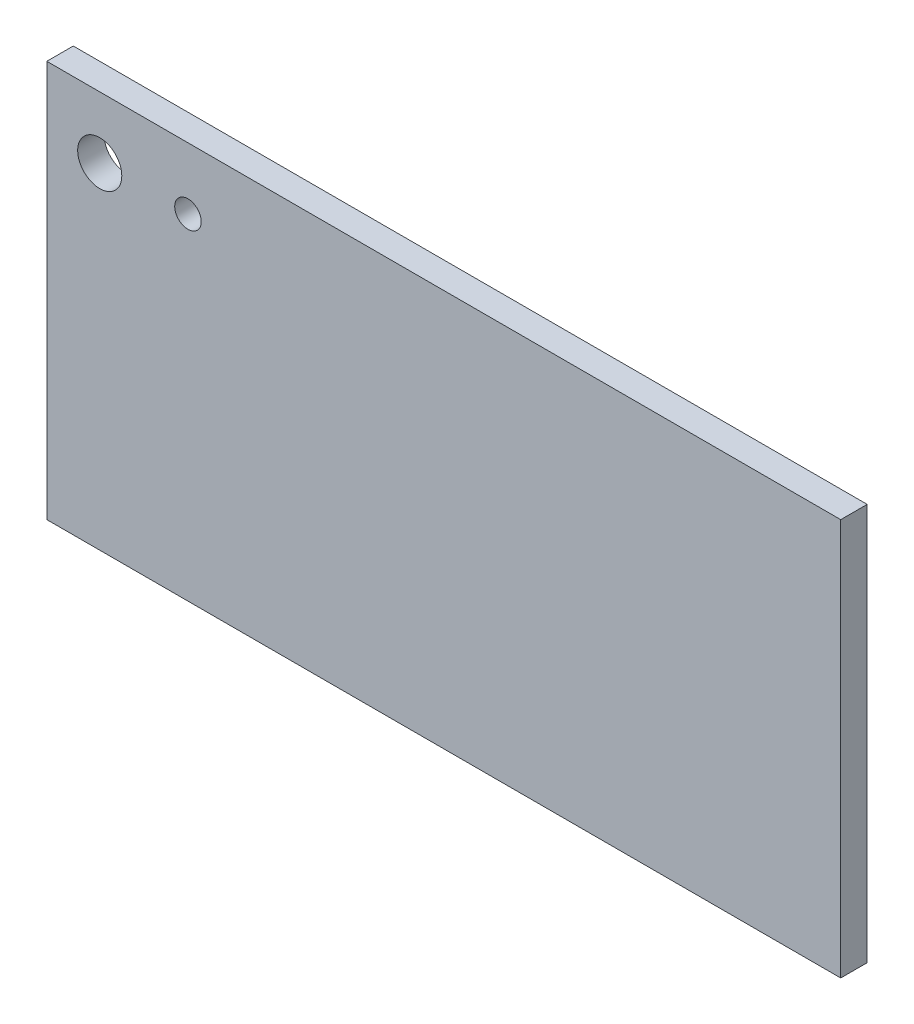
ISO-10303-21;
HEADER;
FILE_DESCRIPTION(('STEP AP214'),'2;1');
FILE_NAME('part.step','',(''),(''),'','','');
FILE_SCHEMA(('AUTOMOTIVE_DESIGN { 1 0 10303 214 1 1 1 1 }'));
ENDSEC;
DATA;
#1=APPLICATION_CONTEXT('core data for automotive mechanical design processes');
#2=APPLICATION_PROTOCOL_DEFINITION('international standard','automotive_design',2000,#1);
#3=PRODUCT_CONTEXT('',#1,'mechanical');
#4=PRODUCT('Part','Part','',(#3));
#5=PRODUCT_RELATED_PRODUCT_CATEGORY('part','',(#4));
#6=PRODUCT_DEFINITION_FORMATION('','',#4);
#7=PRODUCT_DEFINITION_CONTEXT('part definition',#1,'design');
#8=PRODUCT_DEFINITION('design','',#6,#7);
#9=PRODUCT_DEFINITION_SHAPE('','',#8);
#10=(LENGTH_UNIT() NAMED_UNIT(*) SI_UNIT(.MILLI.,.METRE.));
#11=(NAMED_UNIT(*) PLANE_ANGLE_UNIT() SI_UNIT($,.RADIAN.));
#12=(NAMED_UNIT(*) SI_UNIT($,.STERADIAN.) SOLID_ANGLE_UNIT());
#13=UNCERTAINTY_MEASURE_WITH_UNIT(LENGTH_MEASURE(1.E-05),#10,'distance_accuracy_value','');
#14=(GEOMETRIC_REPRESENTATION_CONTEXT(3) GLOBAL_UNCERTAINTY_ASSIGNED_CONTEXT((#13)) GLOBAL_UNIT_ASSIGNED_CONTEXT((#10,
#11,#12)) REPRESENTATION_CONTEXT('',''));
#15=CARTESIAN_POINT('',(0.,0.,0.));
#16=DIRECTION('',(0.,0.,1.));
#17=DIRECTION('',(1.,0.,0.));
#18=AXIS2_PLACEMENT_3D('',#15,#16,#17);
#19=CARTESIAN_POINT('',(0.,0.,3.));
#20=DIRECTION('',(1.,0.,0.));
#21=DIRECTION('',(0.,0.,-1.));
#22=AXIS2_PLACEMENT_3D('',#19,#20,#21);
#23=PLANE('',#22);
#24=DIRECTION('',(0.,-1.,0.));
#25=VECTOR('',#24,1.);
#26=CARTESIAN_POINT('',(0.,0.,0.));
#27=LINE('',#26,#25);
#28=CARTESIAN_POINT('',(0.,45.,0.));
#29=VERTEX_POINT('',#28);
#30=CARTESIAN_POINT('',(0.,0.,0.));
#31=VERTEX_POINT('',#30);
#32=EDGE_CURVE('E93',#29,#31,#27,.T.);
#33=ORIENTED_EDGE('',*,*,#32,.T.);
#34=DIRECTION('',(0.,0.,-1.));
#35=VECTOR('',#34,1.);
#36=CARTESIAN_POINT('',(0.,0.,3.));
#37=LINE('',#36,#35);
#38=CARTESIAN_POINT('',(0.,0.,3.));
#39=VERTEX_POINT('',#38);
#40=EDGE_CURVE('E11',#39,#31,#37,.T.);
#41=ORIENTED_EDGE('',*,*,#40,.F.);
#42=DIRECTION('',(0.,-1.,0.));
#43=VECTOR('',#42,1.);
#44=CARTESIAN_POINT('',(0.,0.,3.));
#45=LINE('',#44,#43);
#46=CARTESIAN_POINT('',(0.,45.,3.));
#47=VERTEX_POINT('',#46);
#48=EDGE_CURVE('E81',#47,#39,#45,.T.);
#49=ORIENTED_EDGE('',*,*,#48,.F.);
#50=DIRECTION('',(0.,0.,-1.));
#51=VECTOR('',#50,1.);
#52=CARTESIAN_POINT('',(0.,45.,3.));
#53=LINE('',#52,#51);
#54=EDGE_CURVE('E89',#47,#29,#53,.T.);
#55=ORIENTED_EDGE('',*,*,#54,.T.);
#56=EDGE_LOOP('',(#33,#41,#49,#55));
#57=FACE_BOUND('',#56,.T.);
#58=ADVANCED_FACE('F30',(#57),#23,.F.);
#59=CARTESIAN_POINT('',(0.,0.,3.));
#60=DIRECTION('',(0.,1.,0.));
#61=DIRECTION('',(0.,0.,1.));
#62=AXIS2_PLACEMENT_3D('',#59,#60,#61);
#63=PLANE('',#62);
#64=DIRECTION('',(1.,0.,0.));
#65=VECTOR('',#64,1.);
#66=CARTESIAN_POINT('',(0.,0.,0.));
#67=LINE('',#66,#65);
#68=CARTESIAN_POINT('',(90.,0.,0.));
#69=VERTEX_POINT('',#68);
#70=EDGE_CURVE('E85',#31,#69,#67,.T.);
#71=ORIENTED_EDGE('',*,*,#70,.T.);
#72=DIRECTION('',(0.,0.,-1.));
#73=VECTOR('',#72,1.);
#74=CARTESIAN_POINT('',(90.,0.,3.));
#75=LINE('',#74,#73);
#76=CARTESIAN_POINT('',(90.,0.,3.));
#77=VERTEX_POINT('',#76);
#78=EDGE_CURVE('E38',#77,#69,#75,.T.);
#79=ORIENTED_EDGE('',*,*,#78,.F.);
#80=DIRECTION('',(1.,0.,0.));
#81=VECTOR('',#80,1.);
#82=CARTESIAN_POINT('',(0.,0.,3.));
#83=LINE('',#82,#81);
#84=EDGE_CURVE('E76',#39,#77,#83,.T.);
#85=ORIENTED_EDGE('',*,*,#84,.F.);
#86=ORIENTED_EDGE('',*,*,#40,.T.);
#87=EDGE_LOOP('',(#71,#79,#85,#86));
#88=FACE_BOUND('',#87,.T.);
#89=ADVANCED_FACE('F84',(#88),#63,.F.);
#90=CARTESIAN_POINT('',(90.,0.,3.));
#91=DIRECTION('',(-1.,0.,0.));
#92=DIRECTION('',(0.,0.,1.));
#93=AXIS2_PLACEMENT_3D('',#90,#91,#92);
#94=PLANE('',#93);
#95=DIRECTION('',(0.,1.,0.));
#96=VECTOR('',#95,1.);
#97=CARTESIAN_POINT('',(90.,0.,0.));
#98=LINE('',#97,#96);
#99=CARTESIAN_POINT('',(90.,45.,0.));
#100=VERTEX_POINT('',#99);
#101=EDGE_CURVE('E63',#69,#100,#98,.T.);
#102=ORIENTED_EDGE('',*,*,#101,.T.);
#103=DIRECTION('',(0.,0.,-1.));
#104=VECTOR('',#103,1.);
#105=CARTESIAN_POINT('',(90.,45.,3.));
#106=LINE('',#105,#104);
#107=CARTESIAN_POINT('',(90.,45.,3.));
#108=VERTEX_POINT('',#107);
#109=EDGE_CURVE('E86',#108,#100,#106,.T.);
#110=ORIENTED_EDGE('',*,*,#109,.F.);
#111=DIRECTION('',(0.,1.,0.));
#112=VECTOR('',#111,1.);
#113=CARTESIAN_POINT('',(90.,0.,3.));
#114=LINE('',#113,#112);
#115=EDGE_CURVE('E79',#77,#108,#114,.T.);
#116=ORIENTED_EDGE('',*,*,#115,.F.);
#117=ORIENTED_EDGE('',*,*,#78,.T.);
#118=EDGE_LOOP('',(#102,#110,#116,#117));
#119=FACE_BOUND('',#118,.T.);
#120=ADVANCED_FACE('F87',(#119),#94,.F.);
#121=CARTESIAN_POINT('',(0.,45.,3.));
#122=DIRECTION('',(0.,-1.,0.));
#123=DIRECTION('',(0.,0.,-1.));
#124=AXIS2_PLACEMENT_3D('',#121,#122,#123);
#125=PLANE('',#124);
#126=DIRECTION('',(-1.,0.,0.));
#127=VECTOR('',#126,1.);
#128=CARTESIAN_POINT('',(0.,45.,0.));
#129=LINE('',#128,#127);
#130=EDGE_CURVE('E69',#100,#29,#129,.T.);
#131=ORIENTED_EDGE('',*,*,#130,.T.);
#132=ORIENTED_EDGE('',*,*,#54,.F.);
#133=DIRECTION('',(-1.,0.,0.));
#134=VECTOR('',#133,1.);
#135=CARTESIAN_POINT('',(0.,45.,3.));
#136=LINE('',#135,#134);
#137=EDGE_CURVE('E46',#108,#47,#136,.T.);
#138=ORIENTED_EDGE('',*,*,#137,.F.);
#139=ORIENTED_EDGE('',*,*,#109,.T.);
#140=EDGE_LOOP('',(#131,#132,#138,#139));
#141=FACE_BOUND('',#140,.T.);
#142=ADVANCED_FACE('F101',(#141),#125,.F.);
#143=CARTESIAN_POINT('',(0.,45.,3.));
#144=DIRECTION('',(0.,0.,-1.));
#145=DIRECTION('',(-1.,0.,0.));
#146=AXIS2_PLACEMENT_3D('',#143,#144,#145);
#147=PLANE('',#146);
#148=CARTESIAN_POINT('',(16.,38.,3.));
#149=DIRECTION('',(0.,0.,1.));
#150=DIRECTION('',(1.,0.,0.));
#151=AXIS2_PLACEMENT_3D('',#148,#149,#150);
#152=CIRCLE('',#151,1.5);
#153=CARTESIAN_POINT('',(17.5,38.,3.));
#154=VERTEX_POINT('',#153);
#155=EDGE_CURVE('E113',#154,#154,#152,.T.);
#156=ORIENTED_EDGE('',*,*,#155,.F.);
#157=EDGE_LOOP('',(#156));
#158=FACE_BOUND('',#157,.T.);
#159=CARTESIAN_POINT('',(6.,38.,3.));
#160=DIRECTION('',(0.,0.,1.));
#161=DIRECTION('',(1.,0.,0.));
#162=AXIS2_PLACEMENT_3D('',#159,#160,#161);
#163=CIRCLE('',#162,2.5);
#164=CARTESIAN_POINT('',(8.5,38.,3.));
#165=VERTEX_POINT('',#164);
#166=EDGE_CURVE('E107',#165,#165,#163,.T.);
#167=ORIENTED_EDGE('',*,*,#166,.F.);
#168=EDGE_LOOP('',(#167));
#169=FACE_BOUND('',#168,.T.);
#170=ORIENTED_EDGE('',*,*,#48,.T.);
#171=ORIENTED_EDGE('',*,*,#84,.T.);
#172=ORIENTED_EDGE('',*,*,#115,.T.);
#173=ORIENTED_EDGE('',*,*,#137,.T.);
#174=EDGE_LOOP('',(#170,#171,#172,#173));
#175=FACE_BOUND('',#174,.T.);
#176=ADVANCED_FACE('F77',(#158,#169,#175),#147,.F.);
#177=CARTESIAN_POINT('',(0.,45.,0.));
#178=DIRECTION('',(0.,0.,-1.));
#179=DIRECTION('',(-1.,0.,0.));
#180=AXIS2_PLACEMENT_3D('',#177,#178,#179);
#181=PLANE('',#180);
#182=CARTESIAN_POINT('',(16.,38.,0.));
#183=DIRECTION('',(0.,0.,1.));
#184=DIRECTION('',(1.,0.,0.));
#185=AXIS2_PLACEMENT_3D('',#182,#183,#184);
#186=CIRCLE('',#185,1.5);
#187=CARTESIAN_POINT('',(17.5,38.,0.));
#188=VERTEX_POINT('',#187);
#189=EDGE_CURVE('E110',#188,#188,#186,.T.);
#190=ORIENTED_EDGE('',*,*,#189,.T.);
#191=EDGE_LOOP('',(#190));
#192=FACE_BOUND('',#191,.T.);
#193=CARTESIAN_POINT('',(6.,38.,0.));
#194=DIRECTION('',(0.,0.,1.));
#195=DIRECTION('',(1.,0.,0.));
#196=AXIS2_PLACEMENT_3D('',#193,#194,#195);
#197=CIRCLE('',#196,2.5);
#198=CARTESIAN_POINT('',(8.5,38.,0.));
#199=VERTEX_POINT('',#198);
#200=EDGE_CURVE('E96',#199,#199,#197,.T.);
#201=ORIENTED_EDGE('',*,*,#200,.T.);
#202=EDGE_LOOP('',(#201));
#203=FACE_BOUND('',#202,.T.);
#204=ORIENTED_EDGE('',*,*,#32,.F.);
#205=ORIENTED_EDGE('',*,*,#130,.F.);
#206=ORIENTED_EDGE('',*,*,#101,.F.);
#207=ORIENTED_EDGE('',*,*,#70,.F.);
#208=EDGE_LOOP('',(#204,#205,#206,#207));
#209=FACE_BOUND('',#208,.T.);
#210=ADVANCED_FACE('F104',(#192,#203,#209),#181,.T.);
#211=CARTESIAN_POINT('',(6.,38.,0.));
#212=DIRECTION('',(0.,0.,1.));
#213=DIRECTION('',(1.,0.,0.));
#214=AXIS2_PLACEMENT_3D('',#211,#212,#213);
#215=CYLINDRICAL_SURFACE('',#214,2.5);
#216=ORIENTED_EDGE('',*,*,#200,.F.);
#217=EDGE_LOOP('',(#216));
#218=FACE_BOUND('',#217,.T.);
#219=ORIENTED_EDGE('',*,*,#166,.T.);
#220=EDGE_LOOP('',(#219));
#221=FACE_BOUND('',#220,.T.);
#222=ADVANCED_FACE('F124',(#218,#221),#215,.F.);
#223=CARTESIAN_POINT('',(16.,38.,0.));
#224=DIRECTION('',(0.,0.,1.));
#225=DIRECTION('',(1.,0.,0.));
#226=AXIS2_PLACEMENT_3D('',#223,#224,#225);
#227=CYLINDRICAL_SURFACE('',#226,1.5);
#228=ORIENTED_EDGE('',*,*,#189,.F.);
#229=EDGE_LOOP('',(#228));
#230=FACE_BOUND('',#229,.T.);
#231=ORIENTED_EDGE('',*,*,#155,.T.);
#232=EDGE_LOOP('',(#231));
#233=FACE_BOUND('',#232,.T.);
#234=ADVANCED_FACE('F121',(#230,#233),#227,.F.);
#235=CLOSED_SHELL('',(#58,#89,#120,#142,#176,#210,#222,#234));
#236=MANIFOLD_SOLID_BREP('B2',#235);
#237=ADVANCED_BREP_SHAPE_REPRESENTATION('',(#18,#236),#14);
#238=SHAPE_DEFINITION_REPRESENTATION(#9,#237);
ENDSEC;
END-ISO-10303-21;
